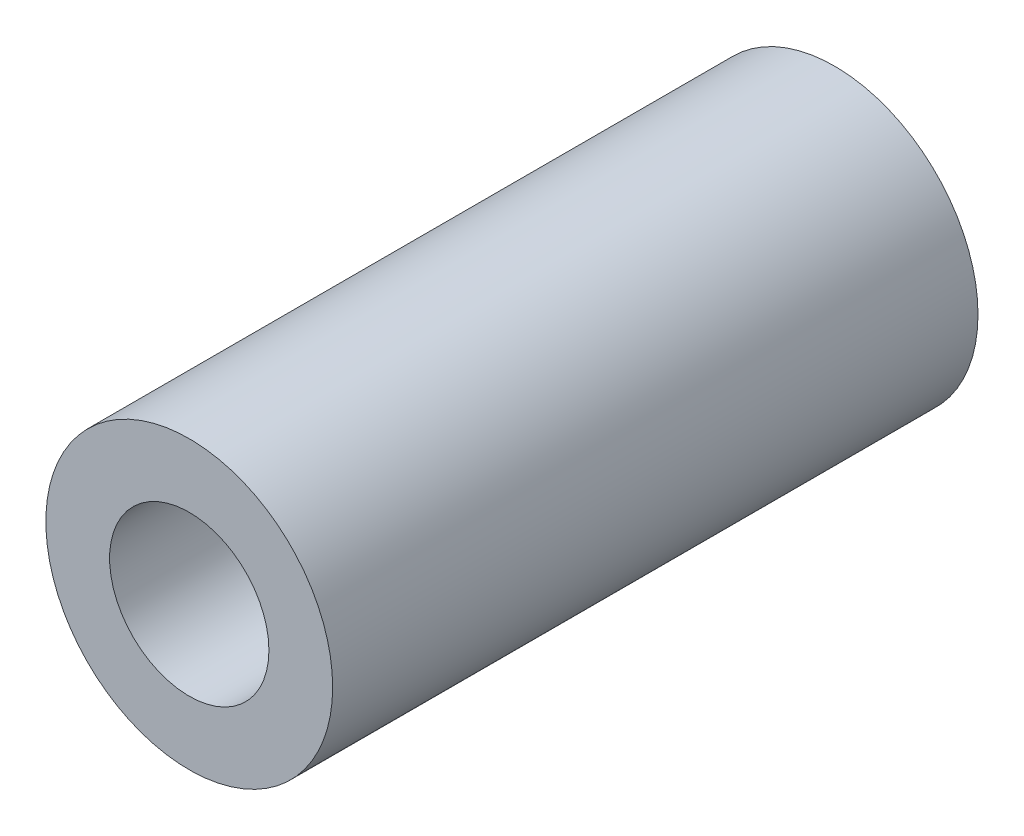
ISO-10303-21;
HEADER;
FILE_DESCRIPTION(('STEP AP214'),'2;1');
FILE_NAME('part.step','',(''),(''),'','','');
FILE_SCHEMA(('AUTOMOTIVE_DESIGN { 1 0 10303 214 1 1 1 1 }'));
ENDSEC;
DATA;
#1=APPLICATION_CONTEXT('core data for automotive mechanical design processes');
#2=APPLICATION_PROTOCOL_DEFINITION('international standard','automotive_design',2000,#1);
#3=PRODUCT_CONTEXT('',#1,'mechanical');
#4=PRODUCT('Part','Part','',(#3));
#5=PRODUCT_RELATED_PRODUCT_CATEGORY('part','',(#4));
#6=PRODUCT_DEFINITION_FORMATION('','',#4);
#7=PRODUCT_DEFINITION_CONTEXT('part definition',#1,'design');
#8=PRODUCT_DEFINITION('design','',#6,#7);
#9=PRODUCT_DEFINITION_SHAPE('','',#8);
#10=(LENGTH_UNIT() NAMED_UNIT(*) SI_UNIT(.MILLI.,.METRE.));
#11=(NAMED_UNIT(*) PLANE_ANGLE_UNIT() SI_UNIT($,.RADIAN.));
#12=(NAMED_UNIT(*) SI_UNIT($,.STERADIAN.) SOLID_ANGLE_UNIT());
#13=UNCERTAINTY_MEASURE_WITH_UNIT(LENGTH_MEASURE(1.E-05),#10,'distance_accuracy_value','');
#14=(GEOMETRIC_REPRESENTATION_CONTEXT(3) GLOBAL_UNCERTAINTY_ASSIGNED_CONTEXT((#13)) GLOBAL_UNIT_ASSIGNED_CONTEXT((#10,
#11,#12)) REPRESENTATION_CONTEXT('',''));
#15=CARTESIAN_POINT('',(0.,0.,0.));
#16=DIRECTION('',(0.,0.,1.));
#17=DIRECTION('',(1.,0.,0.));
#18=AXIS2_PLACEMENT_3D('',#15,#16,#17);
#19=CARTESIAN_POINT('',(0.,0.,20.25));
#20=DIRECTION('',(0.,0.,1.));
#21=DIRECTION('',(1.,0.,0.));
#22=AXIS2_PLACEMENT_3D('',#19,#20,#21);
#23=PLANE('',#22);
#24=CARTESIAN_POINT('',(0.,0.,20.25));
#25=DIRECTION('',(0.,0.,1.));
#26=DIRECTION('',(1.,0.,0.));
#27=AXIS2_PLACEMENT_3D('',#24,#25,#26);
#28=CIRCLE('',#27,9.);
#29=CARTESIAN_POINT('',(9.,0.,20.25));
#30=VERTEX_POINT('',#29);
#31=EDGE_CURVE('E10',#30,#30,#28,.T.);
#32=ORIENTED_EDGE('',*,*,#31,.T.);
#33=EDGE_LOOP('',(#32));
#34=FACE_BOUND('',#33,.T.);
#35=CARTESIAN_POINT('',(0.,0.,20.25));
#36=DIRECTION('',(0.,0.,1.));
#37=DIRECTION('',(1.,0.,0.));
#38=AXIS2_PLACEMENT_3D('',#35,#36,#37);
#39=CIRCLE('',#38,5.);
#40=CARTESIAN_POINT('',(5.,0.,20.25));
#41=VERTEX_POINT('',#40);
#42=EDGE_CURVE('E48',#41,#41,#39,.T.);
#43=ORIENTED_EDGE('',*,*,#42,.F.);
#44=EDGE_LOOP('',(#43));
#45=FACE_BOUND('',#44,.T.);
#46=ADVANCED_FACE('F37',(#34,#45),#23,.T.);
#47=CARTESIAN_POINT('',(0.,0.,-20.25));
#48=DIRECTION('',(0.,0.,1.));
#49=DIRECTION('',(1.,0.,0.));
#50=AXIS2_PLACEMENT_3D('',#47,#48,#49);
#51=PLANE('',#50);
#52=CARTESIAN_POINT('',(0.,0.,-20.25));
#53=DIRECTION('',(0.,0.,1.));
#54=DIRECTION('',(1.,0.,0.));
#55=AXIS2_PLACEMENT_3D('',#52,#53,#54);
#56=CIRCLE('',#55,9.);
#57=CARTESIAN_POINT('',(9.,0.,-20.25));
#58=VERTEX_POINT('',#57);
#59=EDGE_CURVE('E41',#58,#58,#56,.T.);
#60=ORIENTED_EDGE('',*,*,#59,.F.);
#61=EDGE_LOOP('',(#60));
#62=FACE_BOUND('',#61,.T.);
#63=CARTESIAN_POINT('',(0.,0.,-20.25));
#64=DIRECTION('',(0.,0.,1.));
#65=DIRECTION('',(1.,0.,0.));
#66=AXIS2_PLACEMENT_3D('',#63,#64,#65);
#67=CIRCLE('',#66,5.);
#68=CARTESIAN_POINT('',(5.,0.,-20.25));
#69=VERTEX_POINT('',#68);
#70=EDGE_CURVE('E50',#69,#69,#67,.T.);
#71=ORIENTED_EDGE('',*,*,#70,.T.);
#72=EDGE_LOOP('',(#71));
#73=FACE_BOUND('',#72,.T.);
#74=ADVANCED_FACE('F60',(#62,#73),#51,.F.);
#75=CARTESIAN_POINT('',(0.,0.,20.25));
#76=DIRECTION('',(0.,0.,-1.));
#77=DIRECTION('',(-1.,0.,0.));
#78=AXIS2_PLACEMENT_3D('',#75,#76,#77);
#79=CYLINDRICAL_SURFACE('',#78,9.);
#80=ORIENTED_EDGE('',*,*,#31,.F.);
#81=EDGE_LOOP('',(#80));
#82=FACE_BOUND('',#81,.T.);
#83=ORIENTED_EDGE('',*,*,#59,.T.);
#84=EDGE_LOOP('',(#83));
#85=FACE_BOUND('',#84,.T.);
#86=ADVANCED_FACE('F39',(#82,#85),#79,.T.);
#87=CARTESIAN_POINT('',(0.,0.,20.25));
#88=DIRECTION('',(0.,0.,-1.));
#89=DIRECTION('',(-1.,0.,0.));
#90=AXIS2_PLACEMENT_3D('',#87,#88,#89);
#91=CYLINDRICAL_SURFACE('',#90,5.);
#92=ORIENTED_EDGE('',*,*,#42,.T.);
#93=EDGE_LOOP('',(#92));
#94=FACE_BOUND('',#93,.T.);
#95=ORIENTED_EDGE('',*,*,#70,.F.);
#96=EDGE_LOOP('',(#95));
#97=FACE_BOUND('',#96,.T.);
#98=ADVANCED_FACE('F56',(#94,#97),#91,.F.);
#99=CLOSED_SHELL('',(#46,#74,#86,#98));
#100=MANIFOLD_SOLID_BREP('B2',#99);
#101=ADVANCED_BREP_SHAPE_REPRESENTATION('',(#18,#100),#14);
#102=SHAPE_DEFINITION_REPRESENTATION(#9,#101);
ENDSEC;
END-ISO-10303-21;
